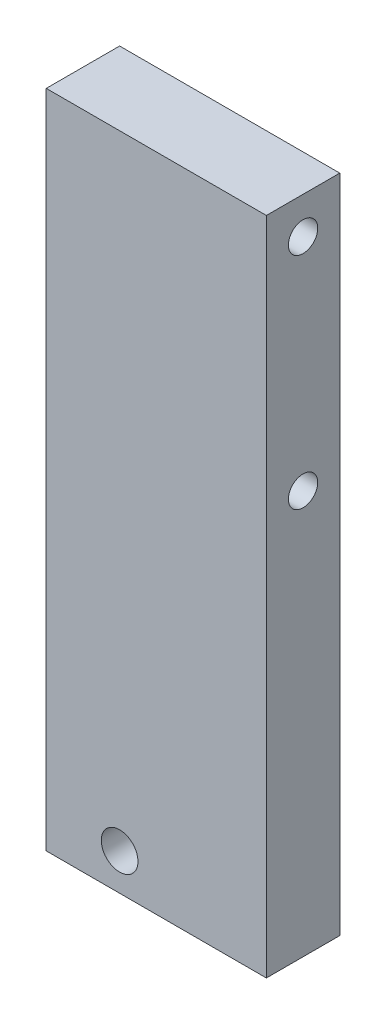
ISO-10303-21;
HEADER;
FILE_DESCRIPTION(('STEP AP214'),'2;1');
FILE_NAME('part.step','',(''),(''),'','','');
FILE_SCHEMA(('AUTOMOTIVE_DESIGN { 1 0 10303 214 1 1 1 1 }'));
ENDSEC;
DATA;
#1=APPLICATION_CONTEXT('core data for automotive mechanical design processes');
#2=APPLICATION_PROTOCOL_DEFINITION('international standard','automotive_design',2000,#1);
#3=PRODUCT_CONTEXT('',#1,'mechanical');
#4=PRODUCT('Part','Part','',(#3));
#5=PRODUCT_RELATED_PRODUCT_CATEGORY('part','',(#4));
#6=PRODUCT_DEFINITION_FORMATION('','',#4);
#7=PRODUCT_DEFINITION_CONTEXT('part definition',#1,'design');
#8=PRODUCT_DEFINITION('design','',#6,#7);
#9=PRODUCT_DEFINITION_SHAPE('','',#8);
#10=(LENGTH_UNIT() NAMED_UNIT(*) SI_UNIT(.MILLI.,.METRE.));
#11=(NAMED_UNIT(*) PLANE_ANGLE_UNIT() SI_UNIT($,.RADIAN.));
#12=(NAMED_UNIT(*) SI_UNIT($,.STERADIAN.) SOLID_ANGLE_UNIT());
#13=UNCERTAINTY_MEASURE_WITH_UNIT(LENGTH_MEASURE(1.E-05),#10,'distance_accuracy_value','');
#14=(GEOMETRIC_REPRESENTATION_CONTEXT(3) GLOBAL_UNCERTAINTY_ASSIGNED_CONTEXT((#13)) GLOBAL_UNIT_ASSIGNED_CONTEXT((#10,
#11,#12)) REPRESENTATION_CONTEXT('',''));
#15=CARTESIAN_POINT('',(0.,0.,0.));
#16=DIRECTION('',(0.,0.,1.));
#17=DIRECTION('',(1.,0.,0.));
#18=AXIS2_PLACEMENT_3D('',#15,#16,#17);
#19=CARTESIAN_POINT('',(0.,0.,10.));
#20=DIRECTION('',(1.,0.,0.));
#21=DIRECTION('',(0.,0.,-1.));
#22=AXIS2_PLACEMENT_3D('',#19,#20,#21);
#23=PLANE('',#22);
#24=CARTESIAN_POINT('',(0.,55.,5.));
#25=DIRECTION('',(1.,0.,0.));
#26=DIRECTION('',(0.,0.,-1.));
#27=AXIS2_PLACEMENT_3D('',#24,#25,#26);
#28=CIRCLE('',#27,2.);
#29=CARTESIAN_POINT('',(0.,55.,3.));
#30=VERTEX_POINT('',#29);
#31=EDGE_CURVE('E119',#30,#30,#28,.T.);
#32=ORIENTED_EDGE('',*,*,#31,.T.);
#33=EDGE_LOOP('',(#32));
#34=FACE_BOUND('',#33,.T.);
#35=CARTESIAN_POINT('',(0.,85.,5.));
#36=DIRECTION('',(1.,0.,0.));
#37=DIRECTION('',(0.,0.,-1.));
#38=AXIS2_PLACEMENT_3D('',#35,#36,#37);
#39=CIRCLE('',#38,2.);
#40=CARTESIAN_POINT('',(0.,85.,3.));
#41=VERTEX_POINT('',#40);
#42=EDGE_CURVE('E113',#41,#41,#39,.T.);
#43=ORIENTED_EDGE('',*,*,#42,.T.);
#44=EDGE_LOOP('',(#43));
#45=FACE_BOUND('',#44,.T.);
#46=DIRECTION('',(0.,-1.,0.));
#47=VECTOR('',#46,1.);
#48=CARTESIAN_POINT('',(0.,0.,0.));
#49=LINE('',#48,#47);
#50=CARTESIAN_POINT('',(0.,90.,0.));
#51=VERTEX_POINT('',#50);
#52=CARTESIAN_POINT('',(0.,0.,0.));
#53=VERTEX_POINT('',#52);
#54=EDGE_CURVE('E96',#51,#53,#49,.T.);
#55=ORIENTED_EDGE('',*,*,#54,.T.);
#56=DIRECTION('',(0.,0.,-1.));
#57=VECTOR('',#56,1.);
#58=CARTESIAN_POINT('',(0.,0.,10.));
#59=LINE('',#58,#57);
#60=CARTESIAN_POINT('',(0.,0.,10.));
#61=VERTEX_POINT('',#60);
#62=EDGE_CURVE('E11',#61,#53,#59,.T.);
#63=ORIENTED_EDGE('',*,*,#62,.F.);
#64=DIRECTION('',(0.,-1.,0.));
#65=VECTOR('',#64,1.);
#66=CARTESIAN_POINT('',(0.,0.,10.));
#67=LINE('',#66,#65);
#68=CARTESIAN_POINT('',(0.,90.,10.));
#69=VERTEX_POINT('',#68);
#70=EDGE_CURVE('E84',#69,#61,#67,.T.);
#71=ORIENTED_EDGE('',*,*,#70,.F.);
#72=DIRECTION('',(0.,0.,-1.));
#73=VECTOR('',#72,1.);
#74=CARTESIAN_POINT('',(0.,90.,10.));
#75=LINE('',#74,#73);
#76=EDGE_CURVE('E92',#69,#51,#75,.T.);
#77=ORIENTED_EDGE('',*,*,#76,.T.);
#78=EDGE_LOOP('',(#55,#63,#71,#77));
#79=FACE_BOUND('',#78,.T.);
#80=ADVANCED_FACE('F33',(#34,#45,#79),#23,.F.);
#81=CARTESIAN_POINT('',(0.,0.,10.));
#82=DIRECTION('',(0.,1.,0.));
#83=DIRECTION('',(0.,0.,1.));
#84=AXIS2_PLACEMENT_3D('',#81,#82,#83);
#85=PLANE('',#84);
#86=DIRECTION('',(1.,0.,0.));
#87=VECTOR('',#86,1.);
#88=CARTESIAN_POINT('',(0.,0.,0.));
#89=LINE('',#88,#87);
#90=CARTESIAN_POINT('',(30.,0.,0.));
#91=VERTEX_POINT('',#90);
#92=EDGE_CURVE('E88',#53,#91,#89,.T.);
#93=ORIENTED_EDGE('',*,*,#92,.T.);
#94=DIRECTION('',(0.,0.,-1.));
#95=VECTOR('',#94,1.);
#96=CARTESIAN_POINT('',(30.,0.,10.));
#97=LINE('',#96,#95);
#98=CARTESIAN_POINT('',(30.,0.,10.));
#99=VERTEX_POINT('',#98);
#100=EDGE_CURVE('E41',#99,#91,#97,.T.);
#101=ORIENTED_EDGE('',*,*,#100,.F.);
#102=DIRECTION('',(1.,0.,0.));
#103=VECTOR('',#102,1.);
#104=CARTESIAN_POINT('',(0.,0.,10.));
#105=LINE('',#104,#103);
#106=EDGE_CURVE('E79',#61,#99,#105,.T.);
#107=ORIENTED_EDGE('',*,*,#106,.F.);
#108=ORIENTED_EDGE('',*,*,#62,.T.);
#109=EDGE_LOOP('',(#93,#101,#107,#108));
#110=FACE_BOUND('',#109,.T.);
#111=ADVANCED_FACE('F87',(#110),#85,.F.);
#112=CARTESIAN_POINT('',(30.,0.,10.));
#113=DIRECTION('',(-1.,0.,0.));
#114=DIRECTION('',(0.,0.,1.));
#115=AXIS2_PLACEMENT_3D('',#112,#113,#114);
#116=PLANE('',#115);
#117=CARTESIAN_POINT('',(30.,55.,5.));
#118=DIRECTION('',(1.,0.,0.));
#119=DIRECTION('',(0.,0.,-1.));
#120=AXIS2_PLACEMENT_3D('',#117,#118,#119);
#121=CIRCLE('',#120,2.);
#122=CARTESIAN_POINT('',(30.,55.,3.));
#123=VERTEX_POINT('',#122);
#124=EDGE_CURVE('E122',#123,#123,#121,.T.);
#125=ORIENTED_EDGE('',*,*,#124,.F.);
#126=EDGE_LOOP('',(#125));
#127=FACE_BOUND('',#126,.T.);
#128=CARTESIAN_POINT('',(30.,85.,5.));
#129=DIRECTION('',(1.,0.,0.));
#130=DIRECTION('',(0.,0.,-1.));
#131=AXIS2_PLACEMENT_3D('',#128,#129,#130);
#132=CIRCLE('',#131,2.);
#133=CARTESIAN_POINT('',(30.,85.,3.));
#134=VERTEX_POINT('',#133);
#135=EDGE_CURVE('E116',#134,#134,#132,.T.);
#136=ORIENTED_EDGE('',*,*,#135,.F.);
#137=EDGE_LOOP('',(#136));
#138=FACE_BOUND('',#137,.T.);
#139=DIRECTION('',(0.,1.,0.));
#140=VECTOR('',#139,1.);
#141=CARTESIAN_POINT('',(30.,0.,0.));
#142=LINE('',#141,#140);
#143=CARTESIAN_POINT('',(30.,90.,0.));
#144=VERTEX_POINT('',#143);
#145=EDGE_CURVE('E66',#91,#144,#142,.T.);
#146=ORIENTED_EDGE('',*,*,#145,.T.);
#147=DIRECTION('',(0.,0.,-1.));
#148=VECTOR('',#147,1.);
#149=CARTESIAN_POINT('',(30.,90.,10.));
#150=LINE('',#149,#148);
#151=CARTESIAN_POINT('',(30.,90.,10.));
#152=VERTEX_POINT('',#151);
#153=EDGE_CURVE('E89',#152,#144,#150,.T.);
#154=ORIENTED_EDGE('',*,*,#153,.F.);
#155=DIRECTION('',(0.,1.,0.));
#156=VECTOR('',#155,1.);
#157=CARTESIAN_POINT('',(30.,0.,10.));
#158=LINE('',#157,#156);
#159=EDGE_CURVE('E82',#99,#152,#158,.T.);
#160=ORIENTED_EDGE('',*,*,#159,.F.);
#161=ORIENTED_EDGE('',*,*,#100,.T.);
#162=EDGE_LOOP('',(#146,#154,#160,#161));
#163=FACE_BOUND('',#162,.T.);
#164=ADVANCED_FACE('F90',(#127,#138,#163),#116,.F.);
#165=CARTESIAN_POINT('',(0.,90.,10.));
#166=DIRECTION('',(0.,-1.,0.));
#167=DIRECTION('',(0.,0.,-1.));
#168=AXIS2_PLACEMENT_3D('',#165,#166,#167);
#169=PLANE('',#168);
#170=DIRECTION('',(-1.,0.,0.));
#171=VECTOR('',#170,1.);
#172=CARTESIAN_POINT('',(0.,90.,0.));
#173=LINE('',#172,#171);
#174=EDGE_CURVE('E72',#144,#51,#173,.T.);
#175=ORIENTED_EDGE('',*,*,#174,.T.);
#176=ORIENTED_EDGE('',*,*,#76,.F.);
#177=DIRECTION('',(-1.,0.,0.));
#178=VECTOR('',#177,1.);
#179=CARTESIAN_POINT('',(0.,90.,10.));
#180=LINE('',#179,#178);
#181=EDGE_CURVE('E49',#152,#69,#180,.T.);
#182=ORIENTED_EDGE('',*,*,#181,.F.);
#183=ORIENTED_EDGE('',*,*,#153,.T.);
#184=EDGE_LOOP('',(#175,#176,#182,#183));
#185=FACE_BOUND('',#184,.T.);
#186=ADVANCED_FACE('F104',(#185),#169,.F.);
#187=CARTESIAN_POINT('',(0.,90.,10.));
#188=DIRECTION('',(0.,0.,-1.));
#189=DIRECTION('',(-1.,0.,0.));
#190=AXIS2_PLACEMENT_3D('',#187,#188,#189);
#191=PLANE('',#190);
#192=CARTESIAN_POINT('',(10.,5.,10.));
#193=DIRECTION('',(0.,0.,1.));
#194=DIRECTION('',(1.,0.,0.));
#195=AXIS2_PLACEMENT_3D('',#192,#193,#194);
#196=CIRCLE('',#195,2.5);
#197=CARTESIAN_POINT('',(12.5,5.,10.));
#198=VERTEX_POINT('',#197);
#199=EDGE_CURVE('E99',#198,#198,#196,.T.);
#200=ORIENTED_EDGE('',*,*,#199,.F.);
#201=EDGE_LOOP('',(#200));
#202=FACE_BOUND('',#201,.T.);
#203=ORIENTED_EDGE('',*,*,#70,.T.);
#204=ORIENTED_EDGE('',*,*,#106,.T.);
#205=ORIENTED_EDGE('',*,*,#159,.T.);
#206=ORIENTED_EDGE('',*,*,#181,.T.);
#207=EDGE_LOOP('',(#203,#204,#205,#206));
#208=FACE_BOUND('',#207,.T.);
#209=ADVANCED_FACE('F80',(#202,#208),#191,.F.);
#210=CARTESIAN_POINT('',(0.,90.,0.));
#211=DIRECTION('',(0.,0.,-1.));
#212=DIRECTION('',(-1.,0.,0.));
#213=AXIS2_PLACEMENT_3D('',#210,#211,#212);
#214=PLANE('',#213);
#215=CARTESIAN_POINT('',(10.,5.,0.));
#216=DIRECTION('',(0.,0.,-1.));
#217=DIRECTION('',(-1.,0.,0.));
#218=AXIS2_PLACEMENT_3D('',#215,#216,#217);
#219=CIRCLE('',#218,2.5);
#220=CARTESIAN_POINT('',(7.5,5.,0.));
#221=VERTEX_POINT('',#220);
#222=EDGE_CURVE('E110',#221,#221,#219,.F.);
#223=ORIENTED_EDGE('',*,*,#222,.T.);
#224=EDGE_LOOP('',(#223));
#225=FACE_BOUND('',#224,.T.);
#226=ORIENTED_EDGE('',*,*,#54,.F.);
#227=ORIENTED_EDGE('',*,*,#174,.F.);
#228=ORIENTED_EDGE('',*,*,#145,.F.);
#229=ORIENTED_EDGE('',*,*,#92,.F.);
#230=EDGE_LOOP('',(#226,#227,#228,#229));
#231=FACE_BOUND('',#230,.T.);
#232=ADVANCED_FACE('F107',(#225,#231),#214,.T.);
#233=CARTESIAN_POINT('',(10.,5.,-0.000999999999999265));
#234=DIRECTION('',(0.,0.,1.));
#235=DIRECTION('',(1.,0.,0.));
#236=AXIS2_PLACEMENT_3D('',#233,#234,#235);
#237=CYLINDRICAL_SURFACE('',#236,2.5);
#238=ORIENTED_EDGE('',*,*,#222,.F.);
#239=EDGE_LOOP('',(#238));
#240=FACE_BOUND('',#239,.T.);
#241=ORIENTED_EDGE('',*,*,#199,.T.);
#242=EDGE_LOOP('',(#241));
#243=FACE_BOUND('',#242,.T.);
#244=ADVANCED_FACE('F143',(#240,#243),#237,.F.);
#245=CARTESIAN_POINT('',(0.,85.,5.));
#246=DIRECTION('',(1.,0.,0.));
#247=DIRECTION('',(0.,0.,-1.));
#248=AXIS2_PLACEMENT_3D('',#245,#246,#247);
#249=CYLINDRICAL_SURFACE('',#248,2.);
#250=ORIENTED_EDGE('',*,*,#42,.F.);
#251=EDGE_LOOP('',(#250));
#252=FACE_BOUND('',#251,.T.);
#253=ORIENTED_EDGE('',*,*,#135,.T.);
#254=EDGE_LOOP('',(#253));
#255=FACE_BOUND('',#254,.T.);
#256=ADVANCED_FACE('F133',(#252,#255),#249,.F.);
#257=CARTESIAN_POINT('',(0.,55.,5.));
#258=DIRECTION('',(1.,0.,0.));
#259=DIRECTION('',(0.,0.,-1.));
#260=AXIS2_PLACEMENT_3D('',#257,#258,#259);
#261=CYLINDRICAL_SURFACE('',#260,2.);
#262=ORIENTED_EDGE('',*,*,#31,.F.);
#263=EDGE_LOOP('',(#262));
#264=FACE_BOUND('',#263,.T.);
#265=ORIENTED_EDGE('',*,*,#124,.T.);
#266=EDGE_LOOP('',(#265));
#267=FACE_BOUND('',#266,.T.);
#268=ADVANCED_FACE('F130',(#264,#267),#261,.F.);
#269=CLOSED_SHELL('',(#80,#111,#164,#186,#209,#232,#244,#256,#268));
#270=MANIFOLD_SOLID_BREP('B2',#269);
#271=ADVANCED_BREP_SHAPE_REPRESENTATION('',(#18,#270),#14);
#272=SHAPE_DEFINITION_REPRESENTATION(#9,#271);
ENDSEC;
END-ISO-10303-21;
